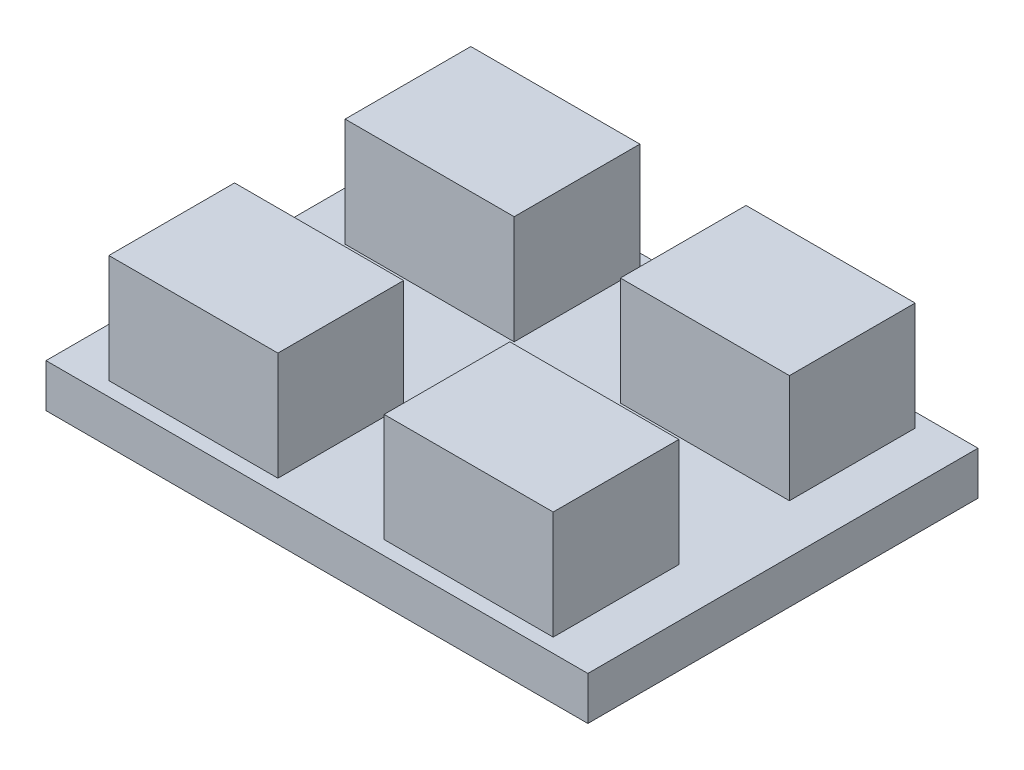
ISO-10303-21;
HEADER;
FILE_DESCRIPTION(('STEP AP214'),'2;1');
FILE_NAME('part.step','',(''),(''),'','','');
FILE_SCHEMA(('AUTOMOTIVE_DESIGN { 1 0 10303 214 1 1 1 1 }'));
ENDSEC;
DATA;
#1=APPLICATION_CONTEXT('core data for automotive mechanical design processes');
#2=APPLICATION_PROTOCOL_DEFINITION('international standard','automotive_design',2000,#1);
#3=PRODUCT_CONTEXT('',#1,'mechanical');
#4=PRODUCT('Part','Part','',(#3));
#5=PRODUCT_RELATED_PRODUCT_CATEGORY('part','',(#4));
#6=PRODUCT_DEFINITION_FORMATION('','',#4);
#7=PRODUCT_DEFINITION_CONTEXT('part definition',#1,'design');
#8=PRODUCT_DEFINITION('design','',#6,#7);
#9=PRODUCT_DEFINITION_SHAPE('','',#8);
#10=(LENGTH_UNIT() NAMED_UNIT(*) SI_UNIT(.MILLI.,.METRE.));
#11=(NAMED_UNIT(*) PLANE_ANGLE_UNIT() SI_UNIT($,.RADIAN.));
#12=(NAMED_UNIT(*) SI_UNIT($,.STERADIAN.) SOLID_ANGLE_UNIT());
#13=UNCERTAINTY_MEASURE_WITH_UNIT(LENGTH_MEASURE(1.E-05),#10,'distance_accuracy_value','');
#14=(GEOMETRIC_REPRESENTATION_CONTEXT(3) GLOBAL_UNCERTAINTY_ASSIGNED_CONTEXT((#13)) GLOBAL_UNIT_ASSIGNED_CONTEXT((#10,
#11,#12)) REPRESENTATION_CONTEXT('',''));
#15=CARTESIAN_POINT('',(0.,0.,0.));
#16=DIRECTION('',(0.,0.,1.));
#17=DIRECTION('',(1.,0.,0.));
#18=AXIS2_PLACEMENT_3D('',#15,#16,#17);
#19=CARTESIAN_POINT('',(0.,2.,0.));
#20=DIRECTION('',(0.,-1.,0.));
#21=DIRECTION('',(0.,0.,-1.));
#22=AXIS2_PLACEMENT_3D('',#19,#20,#21);
#23=PLANE('',#22);
#24=DIRECTION('',(1.,0.,0.));
#25=VECTOR('',#24,1.);
#26=CARTESIAN_POINT('',(2.45,2.,8.35));
#27=LINE('',#26,#25);
#28=CARTESIAN_POINT('',(2.45,2.,8.35));
#29=VERTEX_POINT('',#28);
#30=CARTESIAN_POINT('',(10.25,2.,8.35));
#31=VERTEX_POINT('',#30);
#32=EDGE_CURVE('E191',#29,#31,#27,.T.);
#33=ORIENTED_EDGE('',*,*,#32,.F.);
#34=DIRECTION('',(0.,0.,1.));
#35=VECTOR('',#34,1.);
#36=CARTESIAN_POINT('',(2.45,2.,2.55));
#37=LINE('',#36,#35);
#38=CARTESIAN_POINT('',(2.45,2.,2.55));
#39=VERTEX_POINT('',#38);
#40=EDGE_CURVE('E204',#39,#29,#37,.T.);
#41=ORIENTED_EDGE('',*,*,#40,.F.);
#42=DIRECTION('',(-1.,0.,0.));
#43=VECTOR('',#42,1.);
#44=CARTESIAN_POINT('',(2.45,2.,2.55));
#45=LINE('',#44,#43);
#46=CARTESIAN_POINT('',(10.25,2.,2.55));
#47=VERTEX_POINT('',#46);
#48=EDGE_CURVE('E213',#47,#39,#45,.T.);
#49=ORIENTED_EDGE('',*,*,#48,.F.);
#50=DIRECTION('',(0.,0.,-1.));
#51=VECTOR('',#50,1.);
#52=CARTESIAN_POINT('',(10.25,2.,2.55));
#53=LINE('',#52,#51);
#54=EDGE_CURVE('E194',#31,#47,#53,.T.);
#55=ORIENTED_EDGE('',*,*,#54,.F.);
#56=EDGE_LOOP('',(#33,#41,#49,#55));
#57=FACE_BOUND('',#56,.T.);
#58=DIRECTION('',(0.,0.,-1.));
#59=VECTOR('',#58,1.);
#60=CARTESIAN_POINT('',(-2.45,2.,-8.35));
#61=LINE('',#60,#59);
#62=CARTESIAN_POINT('',(-2.45,2.,-2.55));
#63=VERTEX_POINT('',#62);
#64=CARTESIAN_POINT('',(-2.45,2.,-8.35));
#65=VERTEX_POINT('',#64);
#66=EDGE_CURVE('E262',#63,#65,#61,.T.);
#67=ORIENTED_EDGE('',*,*,#66,.F.);
#68=DIRECTION('',(1.,0.,0.));
#69=VECTOR('',#68,1.);
#70=CARTESIAN_POINT('',(-10.25,2.,-2.55));
#71=LINE('',#70,#69);
#72=CARTESIAN_POINT('',(-10.25,2.,-2.55));
#73=VERTEX_POINT('',#72);
#74=EDGE_CURVE('E267',#73,#63,#71,.T.);
#75=ORIENTED_EDGE('',*,*,#74,.F.);
#76=DIRECTION('',(0.,0.,1.));
#77=VECTOR('',#76,1.);
#78=CARTESIAN_POINT('',(-10.25,2.,-8.35));
#79=LINE('',#78,#77);
#80=CARTESIAN_POINT('',(-10.25,2.,-8.35));
#81=VERTEX_POINT('',#80);
#82=EDGE_CURVE('E279',#81,#73,#79,.T.);
#83=ORIENTED_EDGE('',*,*,#82,.F.);
#84=DIRECTION('',(-1.,0.,0.));
#85=VECTOR('',#84,1.);
#86=CARTESIAN_POINT('',(-10.25,2.,-8.35));
#87=LINE('',#86,#85);
#88=EDGE_CURVE('E276',#65,#81,#87,.T.);
#89=ORIENTED_EDGE('',*,*,#88,.F.);
#90=EDGE_LOOP('',(#67,#75,#83,#89));
#91=FACE_BOUND('',#90,.T.);
#92=DIRECTION('',(0.,0.,-1.));
#93=VECTOR('',#92,1.);
#94=CARTESIAN_POINT('',(12.5,2.,9.));
#95=LINE('',#94,#93);
#96=CARTESIAN_POINT('',(12.5,2.,9.));
#97=VERTEX_POINT('',#96);
#98=CARTESIAN_POINT('',(12.5,2.,-9.));
#99=VERTEX_POINT('',#98);
#100=EDGE_CURVE('E296',#97,#99,#95,.T.);
#101=ORIENTED_EDGE('',*,*,#100,.T.);
#102=DIRECTION('',(-1.,0.,0.));
#103=VECTOR('',#102,1.);
#104=CARTESIAN_POINT('',(-12.5,2.,-9.));
#105=LINE('',#104,#103);
#106=CARTESIAN_POINT('',(-12.5,2.,-9.));
#107=VERTEX_POINT('',#106);
#108=EDGE_CURVE('E299',#99,#107,#105,.T.);
#109=ORIENTED_EDGE('',*,*,#108,.T.);
#110=DIRECTION('',(0.,0.,1.));
#111=VECTOR('',#110,1.);
#112=CARTESIAN_POINT('',(-12.5,2.,9.));
#113=LINE('',#112,#111);
#114=CARTESIAN_POINT('',(-12.5,2.,9.));
#115=VERTEX_POINT('',#114);
#116=EDGE_CURVE('E302',#107,#115,#113,.T.);
#117=ORIENTED_EDGE('',*,*,#116,.T.);
#118=DIRECTION('',(1.,0.,0.));
#119=VECTOR('',#118,1.);
#120=CARTESIAN_POINT('',(-12.5,2.,9.));
#121=LINE('',#120,#119);
#122=EDGE_CURVE('E304',#115,#97,#121,.T.);
#123=ORIENTED_EDGE('',*,*,#122,.T.);
#124=EDGE_LOOP('',(#101,#109,#117,#123));
#125=FACE_BOUND('',#124,.T.);
#126=DIRECTION('',(1.,0.,0.));
#127=VECTOR('',#126,1.);
#128=CARTESIAN_POINT('',(2.45,2.,-2.55));
#129=LINE('',#128,#127);
#130=CARTESIAN_POINT('',(2.45,2.,-2.55));
#131=VERTEX_POINT('',#130);
#132=CARTESIAN_POINT('',(10.25,2.,-2.55));
#133=VERTEX_POINT('',#132);
#134=EDGE_CURVE('E229',#131,#133,#129,.T.);
#135=ORIENTED_EDGE('',*,*,#134,.F.);
#136=DIRECTION('',(0.,0.,1.));
#137=VECTOR('',#136,1.);
#138=CARTESIAN_POINT('',(2.45,2.,-8.35));
#139=LINE('',#138,#137);
#140=CARTESIAN_POINT('',(2.45,2.,-8.35));
#141=VERTEX_POINT('',#140);
#142=EDGE_CURVE('E234',#141,#131,#139,.T.);
#143=ORIENTED_EDGE('',*,*,#142,.F.);
#144=DIRECTION('',(-1.,0.,0.));
#145=VECTOR('',#144,1.);
#146=CARTESIAN_POINT('',(2.45,2.,-8.35));
#147=LINE('',#146,#145);
#148=CARTESIAN_POINT('',(10.25,2.,-8.35));
#149=VERTEX_POINT('',#148);
#150=EDGE_CURVE('E246',#149,#141,#147,.T.);
#151=ORIENTED_EDGE('',*,*,#150,.F.);
#152=DIRECTION('',(0.,0.,-1.));
#153=VECTOR('',#152,1.);
#154=CARTESIAN_POINT('',(10.25,2.,-8.35));
#155=LINE('',#154,#153);
#156=EDGE_CURVE('E243',#133,#149,#155,.T.);
#157=ORIENTED_EDGE('',*,*,#156,.F.);
#158=EDGE_LOOP('',(#135,#143,#151,#157));
#159=FACE_BOUND('',#158,.T.);
#160=DIRECTION('',(1.,0.,0.));
#161=VECTOR('',#160,1.);
#162=CARTESIAN_POINT('',(-10.25,2.,8.35));
#163=LINE('',#162,#161);
#164=CARTESIAN_POINT('',(-10.25,2.,8.35));
#165=VERTEX_POINT('',#164);
#166=CARTESIAN_POINT('',(-2.45,2.,8.35));
#167=VERTEX_POINT('',#166);
#168=EDGE_CURVE('E190',#165,#167,#163,.T.);
#169=ORIENTED_EDGE('',*,*,#168,.F.);
#170=DIRECTION('',(0.,0.,1.));
#171=VECTOR('',#170,1.);
#172=CARTESIAN_POINT('',(-10.25,2.,2.55));
#173=LINE('',#172,#171);
#174=CARTESIAN_POINT('',(-10.25,2.,2.55));
#175=VERTEX_POINT('',#174);
#176=EDGE_CURVE('E187',#175,#165,#173,.T.);
#177=ORIENTED_EDGE('',*,*,#176,.F.);
#178=DIRECTION('',(-1.,0.,0.));
#179=VECTOR('',#178,1.);
#180=CARTESIAN_POINT('',(-10.25,2.,2.55));
#181=LINE('',#180,#179);
#182=CARTESIAN_POINT('',(-2.45,2.,2.55));
#183=VERTEX_POINT('',#182);
#184=EDGE_CURVE('E53',#183,#175,#181,.T.);
#185=ORIENTED_EDGE('',*,*,#184,.F.);
#186=DIRECTION('',(0.,0.,-1.));
#187=VECTOR('',#186,1.);
#188=CARTESIAN_POINT('',(-2.45,2.,2.55));
#189=LINE('',#188,#187);
#190=EDGE_CURVE('E48',#167,#183,#189,.T.);
#191=ORIENTED_EDGE('',*,*,#190,.F.);
#192=EDGE_LOOP('',(#169,#177,#185,#191));
#193=FACE_BOUND('',#192,.T.);
#194=ADVANCED_FACE('F33',(#57,#91,#125,#159,#193),#23,.F.);
#195=CARTESIAN_POINT('',(12.5,2.,9.));
#196=DIRECTION('',(-1.,0.,0.));
#197=DIRECTION('',(0.,0.,1.));
#198=AXIS2_PLACEMENT_3D('',#195,#196,#197);
#199=PLANE('',#198);
#200=DIRECTION('',(0.,0.,-1.));
#201=VECTOR('',#200,1.);
#202=CARTESIAN_POINT('',(12.5,0.,9.));
#203=LINE('',#202,#201);
#204=CARTESIAN_POINT('',(12.5,0.,9.));
#205=VERTEX_POINT('',#204);
#206=CARTESIAN_POINT('',(12.5,0.,-9.));
#207=VERTEX_POINT('',#206);
#208=EDGE_CURVE('E295',#205,#207,#203,.T.);
#209=ORIENTED_EDGE('',*,*,#208,.T.);
#210=DIRECTION('',(0.,-1.,0.));
#211=VECTOR('',#210,1.);
#212=CARTESIAN_POINT('',(12.5,2.,-9.));
#213=LINE('',#212,#211);
#214=EDGE_CURVE('E11',#99,#207,#213,.T.);
#215=ORIENTED_EDGE('',*,*,#214,.F.);
#216=ORIENTED_EDGE('',*,*,#100,.F.);
#217=DIRECTION('',(0.,-1.,0.));
#218=VECTOR('',#217,1.);
#219=CARTESIAN_POINT('',(12.5,2.,9.));
#220=LINE('',#219,#218);
#221=EDGE_CURVE('E306',#97,#205,#220,.T.);
#222=ORIENTED_EDGE('',*,*,#221,.T.);
#223=EDGE_LOOP('',(#209,#215,#216,#222));
#224=FACE_BOUND('',#223,.T.);
#225=ADVANCED_FACE('F35',(#224),#199,.F.);
#226=CARTESIAN_POINT('',(-12.5,2.,-9.));
#227=DIRECTION('',(0.,0.,1.));
#228=DIRECTION('',(1.,0.,0.));
#229=AXIS2_PLACEMENT_3D('',#226,#227,#228);
#230=PLANE('',#229);
#231=DIRECTION('',(-1.,0.,0.));
#232=VECTOR('',#231,1.);
#233=CARTESIAN_POINT('',(-12.5,0.,-9.));
#234=LINE('',#233,#232);
#235=CARTESIAN_POINT('',(-12.5,0.,-9.));
#236=VERTEX_POINT('',#235);
#237=EDGE_CURVE('E309',#207,#236,#234,.T.);
#238=ORIENTED_EDGE('',*,*,#237,.T.);
#239=DIRECTION('',(0.,-1.,0.));
#240=VECTOR('',#239,1.);
#241=CARTESIAN_POINT('',(-12.5,2.,-9.));
#242=LINE('',#241,#240);
#243=EDGE_CURVE('E41',#107,#236,#242,.T.);
#244=ORIENTED_EDGE('',*,*,#243,.F.);
#245=ORIENTED_EDGE('',*,*,#108,.F.);
#246=ORIENTED_EDGE('',*,*,#214,.T.);
#247=EDGE_LOOP('',(#238,#244,#245,#246));
#248=FACE_BOUND('',#247,.T.);
#249=ADVANCED_FACE('F339',(#248),#230,.F.);
#250=CARTESIAN_POINT('',(-12.5,2.,9.));
#251=DIRECTION('',(1.,0.,0.));
#252=DIRECTION('',(0.,0.,-1.));
#253=AXIS2_PLACEMENT_3D('',#250,#251,#252);
#254=PLANE('',#253);
#255=DIRECTION('',(0.,0.,1.));
#256=VECTOR('',#255,1.);
#257=CARTESIAN_POINT('',(-12.5,0.,9.));
#258=LINE('',#257,#256);
#259=CARTESIAN_POINT('',(-12.5,0.,9.));
#260=VERTEX_POINT('',#259);
#261=EDGE_CURVE('E311',#236,#260,#258,.T.);
#262=ORIENTED_EDGE('',*,*,#261,.T.);
#263=DIRECTION('',(0.,-1.,0.));
#264=VECTOR('',#263,1.);
#265=CARTESIAN_POINT('',(-12.5,2.,9.));
#266=LINE('',#265,#264);
#267=EDGE_CURVE('E316',#115,#260,#266,.T.);
#268=ORIENTED_EDGE('',*,*,#267,.F.);
#269=ORIENTED_EDGE('',*,*,#116,.F.);
#270=ORIENTED_EDGE('',*,*,#243,.T.);
#271=EDGE_LOOP('',(#262,#268,#269,#270));
#272=FACE_BOUND('',#271,.T.);
#273=ADVANCED_FACE('F323',(#272),#254,.F.);
#274=CARTESIAN_POINT('',(-12.5,2.,9.));
#275=DIRECTION('',(0.,0.,-1.));
#276=DIRECTION('',(-1.,0.,0.));
#277=AXIS2_PLACEMENT_3D('',#274,#275,#276);
#278=PLANE('',#277);
#279=DIRECTION('',(1.,0.,0.));
#280=VECTOR('',#279,1.);
#281=CARTESIAN_POINT('',(-12.5,0.,9.));
#282=LINE('',#281,#280);
#283=EDGE_CURVE('E300',#260,#205,#282,.T.);
#284=ORIENTED_EDGE('',*,*,#283,.T.);
#285=ORIENTED_EDGE('',*,*,#221,.F.);
#286=ORIENTED_EDGE('',*,*,#122,.F.);
#287=ORIENTED_EDGE('',*,*,#267,.T.);
#288=EDGE_LOOP('',(#284,#285,#286,#287));
#289=FACE_BOUND('',#288,.T.);
#290=ADVANCED_FACE('F332',(#289),#278,.F.);
#291=CARTESIAN_POINT('',(0.,0.,0.));
#292=DIRECTION('',(0.,-1.,0.));
#293=DIRECTION('',(0.,0.,-1.));
#294=AXIS2_PLACEMENT_3D('',#291,#292,#293);
#295=PLANE('',#294);
#296=ORIENTED_EDGE('',*,*,#208,.F.);
#297=ORIENTED_EDGE('',*,*,#283,.F.);
#298=ORIENTED_EDGE('',*,*,#261,.F.);
#299=ORIENTED_EDGE('',*,*,#237,.F.);
#300=EDGE_LOOP('',(#296,#297,#298,#299));
#301=FACE_BOUND('',#300,.T.);
#302=ADVANCED_FACE('F329',(#301),#295,.T.);
#303=CARTESIAN_POINT('',(-2.45,7.,-8.35));
#304=DIRECTION('',(-1.,0.,0.));
#305=DIRECTION('',(0.,0.,1.));
#306=AXIS2_PLACEMENT_3D('',#303,#304,#305);
#307=PLANE('',#306);
#308=ORIENTED_EDGE('',*,*,#66,.T.);
#309=DIRECTION('',(0.,-1.,0.));
#310=VECTOR('',#309,1.);
#311=CARTESIAN_POINT('',(-2.45,7.,-8.35));
#312=LINE('',#311,#310);
#313=CARTESIAN_POINT('',(-2.45,7.,-8.35));
#314=VERTEX_POINT('',#313);
#315=EDGE_CURVE('E292',#314,#65,#312,.T.);
#316=ORIENTED_EDGE('',*,*,#315,.F.);
#317=DIRECTION('',(0.,0.,-1.));
#318=VECTOR('',#317,1.);
#319=CARTESIAN_POINT('',(-2.45,7.,-8.35));
#320=LINE('',#319,#318);
#321=CARTESIAN_POINT('',(-2.45,7.,-2.55));
#322=VERTEX_POINT('',#321);
#323=EDGE_CURVE('E263',#322,#314,#320,.T.);
#324=ORIENTED_EDGE('',*,*,#323,.F.);
#325=DIRECTION('',(0.,-1.,0.));
#326=VECTOR('',#325,1.);
#327=CARTESIAN_POINT('',(-2.45,7.,-2.55));
#328=LINE('',#327,#326);
#329=EDGE_CURVE('E273',#322,#63,#328,.T.);
#330=ORIENTED_EDGE('',*,*,#329,.T.);
#331=EDGE_LOOP('',(#308,#316,#324,#330));
#332=FACE_BOUND('',#331,.T.);
#333=ADVANCED_FACE('F354',(#332),#307,.F.);
#334=CARTESIAN_POINT('',(-10.25,7.,-8.35));
#335=DIRECTION('',(0.,0.,1.));
#336=DIRECTION('',(1.,0.,0.));
#337=AXIS2_PLACEMENT_3D('',#334,#335,#336);
#338=PLANE('',#337);
#339=ORIENTED_EDGE('',*,*,#88,.T.);
#340=DIRECTION('',(0.,-1.,0.));
#341=VECTOR('',#340,1.);
#342=CARTESIAN_POINT('',(-10.25,7.,-8.35));
#343=LINE('',#342,#341);
#344=CARTESIAN_POINT('',(-10.25,7.,-8.35));
#345=VERTEX_POINT('',#344);
#346=EDGE_CURVE('E289',#345,#81,#343,.T.);
#347=ORIENTED_EDGE('',*,*,#346,.F.);
#348=DIRECTION('',(-1.,0.,0.));
#349=VECTOR('',#348,1.);
#350=CARTESIAN_POINT('',(-10.25,7.,-8.35));
#351=LINE('',#350,#349);
#352=EDGE_CURVE('E266',#314,#345,#351,.T.);
#353=ORIENTED_EDGE('',*,*,#352,.F.);
#354=ORIENTED_EDGE('',*,*,#315,.T.);
#355=EDGE_LOOP('',(#339,#347,#353,#354));
#356=FACE_BOUND('',#355,.T.);
#357=ADVANCED_FACE('F373',(#356),#338,.F.);
#358=CARTESIAN_POINT('',(-10.25,7.,-8.35));
#359=DIRECTION('',(1.,0.,0.));
#360=DIRECTION('',(0.,0.,-1.));
#361=AXIS2_PLACEMENT_3D('',#358,#359,#360);
#362=PLANE('',#361);
#363=ORIENTED_EDGE('',*,*,#82,.T.);
#364=DIRECTION('',(0.,-1.,0.));
#365=VECTOR('',#364,1.);
#366=CARTESIAN_POINT('',(-10.25,7.,-2.55));
#367=LINE('',#366,#365);
#368=CARTESIAN_POINT('',(-10.25,7.,-2.55));
#369=VERTEX_POINT('',#368);
#370=EDGE_CURVE('E286',#369,#73,#367,.T.);
#371=ORIENTED_EDGE('',*,*,#370,.F.);
#372=DIRECTION('',(0.,0.,1.));
#373=VECTOR('',#372,1.);
#374=CARTESIAN_POINT('',(-10.25,7.,-8.35));
#375=LINE('',#374,#373);
#376=EDGE_CURVE('E269',#345,#369,#375,.T.);
#377=ORIENTED_EDGE('',*,*,#376,.F.);
#378=ORIENTED_EDGE('',*,*,#346,.T.);
#379=EDGE_LOOP('',(#363,#371,#377,#378));
#380=FACE_BOUND('',#379,.T.);
#381=ADVANCED_FACE('F380',(#380),#362,.F.);
#382=CARTESIAN_POINT('',(-10.25,7.,-2.55));
#383=DIRECTION('',(0.,0.,-1.));
#384=DIRECTION('',(-1.,0.,0.));
#385=AXIS2_PLACEMENT_3D('',#382,#383,#384);
#386=PLANE('',#385);
#387=ORIENTED_EDGE('',*,*,#74,.T.);
#388=ORIENTED_EDGE('',*,*,#329,.F.);
#389=DIRECTION('',(1.,0.,0.));
#390=VECTOR('',#389,1.);
#391=CARTESIAN_POINT('',(-10.25,7.,-2.55));
#392=LINE('',#391,#390);
#393=EDGE_CURVE('E271',#369,#322,#392,.T.);
#394=ORIENTED_EDGE('',*,*,#393,.F.);
#395=ORIENTED_EDGE('',*,*,#370,.T.);
#396=EDGE_LOOP('',(#387,#388,#394,#395));
#397=FACE_BOUND('',#396,.T.);
#398=ADVANCED_FACE('F387',(#397),#386,.F.);
#399=CARTESIAN_POINT('',(0.,7.,0.));
#400=DIRECTION('',(0.,1.,0.));
#401=DIRECTION('',(0.,0.,1.));
#402=AXIS2_PLACEMENT_3D('',#399,#400,#401);
#403=PLANE('',#402);
#404=ORIENTED_EDGE('',*,*,#323,.T.);
#405=ORIENTED_EDGE('',*,*,#352,.T.);
#406=ORIENTED_EDGE('',*,*,#376,.T.);
#407=ORIENTED_EDGE('',*,*,#393,.T.);
#408=EDGE_LOOP('',(#404,#405,#406,#407));
#409=FACE_BOUND('',#408,.T.);
#410=ADVANCED_FACE('F395',(#409),#403,.T.);
#411=CARTESIAN_POINT('',(2.45,7.,-2.55));
#412=DIRECTION('',(0.,0.,-1.));
#413=DIRECTION('',(-1.,0.,0.));
#414=AXIS2_PLACEMENT_3D('',#411,#412,#413);
#415=PLANE('',#414);
#416=ORIENTED_EDGE('',*,*,#134,.T.);
#417=DIRECTION('',(0.,-1.,0.));
#418=VECTOR('',#417,1.);
#419=CARTESIAN_POINT('',(10.25,7.,-2.55));
#420=LINE('',#419,#418);
#421=CARTESIAN_POINT('',(10.25,7.,-2.55));
#422=VERTEX_POINT('',#421);
#423=EDGE_CURVE('E259',#422,#133,#420,.T.);
#424=ORIENTED_EDGE('',*,*,#423,.F.);
#425=DIRECTION('',(1.,0.,0.));
#426=VECTOR('',#425,1.);
#427=CARTESIAN_POINT('',(2.45,7.,-2.55));
#428=LINE('',#427,#426);
#429=CARTESIAN_POINT('',(2.45,7.,-2.55));
#430=VERTEX_POINT('',#429);
#431=EDGE_CURVE('E230',#430,#422,#428,.T.);
#432=ORIENTED_EDGE('',*,*,#431,.F.);
#433=DIRECTION('',(0.,-1.,0.));
#434=VECTOR('',#433,1.);
#435=CARTESIAN_POINT('',(2.45,7.,-2.55));
#436=LINE('',#435,#434);
#437=EDGE_CURVE('E240',#430,#131,#436,.T.);
#438=ORIENTED_EDGE('',*,*,#437,.T.);
#439=EDGE_LOOP('',(#416,#424,#432,#438));
#440=FACE_BOUND('',#439,.T.);
#441=ADVANCED_FACE('F403',(#440),#415,.F.);
#442=CARTESIAN_POINT('',(10.25,7.,-8.35));
#443=DIRECTION('',(-1.,0.,0.));
#444=DIRECTION('',(0.,0.,1.));
#445=AXIS2_PLACEMENT_3D('',#442,#443,#444);
#446=PLANE('',#445);
#447=ORIENTED_EDGE('',*,*,#156,.T.);
#448=DIRECTION('',(0.,-1.,0.));
#449=VECTOR('',#448,1.);
#450=CARTESIAN_POINT('',(10.25,7.,-8.35));
#451=LINE('',#450,#449);
#452=CARTESIAN_POINT('',(10.25,7.,-8.35));
#453=VERTEX_POINT('',#452);
#454=EDGE_CURVE('E256',#453,#149,#451,.T.);
#455=ORIENTED_EDGE('',*,*,#454,.F.);
#456=DIRECTION('',(0.,0.,-1.));
#457=VECTOR('',#456,1.);
#458=CARTESIAN_POINT('',(10.25,7.,-8.35));
#459=LINE('',#458,#457);
#460=EDGE_CURVE('E233',#422,#453,#459,.T.);
#461=ORIENTED_EDGE('',*,*,#460,.F.);
#462=ORIENTED_EDGE('',*,*,#423,.T.);
#463=EDGE_LOOP('',(#447,#455,#461,#462));
#464=FACE_BOUND('',#463,.T.);
#465=ADVANCED_FACE('F411',(#464),#446,.F.);
#466=CARTESIAN_POINT('',(2.45,7.,-8.35));
#467=DIRECTION('',(0.,0.,1.));
#468=DIRECTION('',(1.,0.,0.));
#469=AXIS2_PLACEMENT_3D('',#466,#467,#468);
#470=PLANE('',#469);
#471=ORIENTED_EDGE('',*,*,#150,.T.);
#472=DIRECTION('',(0.,-1.,0.));
#473=VECTOR('',#472,1.);
#474=CARTESIAN_POINT('',(2.45,7.,-8.35));
#475=LINE('',#474,#473);
#476=CARTESIAN_POINT('',(2.45,7.,-8.35));
#477=VERTEX_POINT('',#476);
#478=EDGE_CURVE('E253',#477,#141,#475,.T.);
#479=ORIENTED_EDGE('',*,*,#478,.F.);
#480=DIRECTION('',(-1.,0.,0.));
#481=VECTOR('',#480,1.);
#482=CARTESIAN_POINT('',(2.45,7.,-8.35));
#483=LINE('',#482,#481);
#484=EDGE_CURVE('E236',#453,#477,#483,.T.);
#485=ORIENTED_EDGE('',*,*,#484,.F.);
#486=ORIENTED_EDGE('',*,*,#454,.T.);
#487=EDGE_LOOP('',(#471,#479,#485,#486));
#488=FACE_BOUND('',#487,.T.);
#489=ADVANCED_FACE('F419',(#488),#470,.F.);
#490=CARTESIAN_POINT('',(2.45,7.,-8.35));
#491=DIRECTION('',(1.,0.,0.));
#492=DIRECTION('',(0.,0.,-1.));
#493=AXIS2_PLACEMENT_3D('',#490,#491,#492);
#494=PLANE('',#493);
#495=ORIENTED_EDGE('',*,*,#142,.T.);
#496=ORIENTED_EDGE('',*,*,#437,.F.);
#497=DIRECTION('',(0.,0.,1.));
#498=VECTOR('',#497,1.);
#499=CARTESIAN_POINT('',(2.45,7.,-8.35));
#500=LINE('',#499,#498);
#501=EDGE_CURVE('E238',#477,#430,#500,.T.);
#502=ORIENTED_EDGE('',*,*,#501,.F.);
#503=ORIENTED_EDGE('',*,*,#478,.T.);
#504=EDGE_LOOP('',(#495,#496,#502,#503));
#505=FACE_BOUND('',#504,.T.);
#506=ADVANCED_FACE('F427',(#505),#494,.F.);
#507=CARTESIAN_POINT('',(0.,7.,0.));
#508=DIRECTION('',(0.,-1.,0.));
#509=DIRECTION('',(0.,0.,-1.));
#510=AXIS2_PLACEMENT_3D('',#507,#508,#509);
#511=PLANE('',#510);
#512=ORIENTED_EDGE('',*,*,#431,.T.);
#513=ORIENTED_EDGE('',*,*,#460,.T.);
#514=ORIENTED_EDGE('',*,*,#484,.T.);
#515=ORIENTED_EDGE('',*,*,#501,.T.);
#516=EDGE_LOOP('',(#512,#513,#514,#515));
#517=FACE_BOUND('',#516,.T.);
#518=ADVANCED_FACE('F435',(#517),#511,.F.);
#519=CARTESIAN_POINT('',(2.45,7.,8.35));
#520=DIRECTION('',(0.,0.,-1.));
#521=DIRECTION('',(-1.,0.,0.));
#522=AXIS2_PLACEMENT_3D('',#519,#520,#521);
#523=PLANE('',#522);
#524=ORIENTED_EDGE('',*,*,#32,.T.);
#525=DIRECTION('',(0.,-1.,0.));
#526=VECTOR('',#525,1.);
#527=CARTESIAN_POINT('',(10.25,7.,8.35));
#528=LINE('',#527,#526);
#529=CARTESIAN_POINT('',(10.25,7.,8.35));
#530=VERTEX_POINT('',#529);
#531=EDGE_CURVE('E226',#530,#31,#528,.T.);
#532=ORIENTED_EDGE('',*,*,#531,.F.);
#533=DIRECTION('',(1.,0.,0.));
#534=VECTOR('',#533,1.);
#535=CARTESIAN_POINT('',(2.45,7.,8.35));
#536=LINE('',#535,#534);
#537=CARTESIAN_POINT('',(2.45,7.,8.35));
#538=VERTEX_POINT('',#537);
#539=EDGE_CURVE('E200',#538,#530,#536,.T.);
#540=ORIENTED_EDGE('',*,*,#539,.F.);
#541=DIRECTION('',(0.,-1.,0.));
#542=VECTOR('',#541,1.);
#543=CARTESIAN_POINT('',(2.45,7.,8.35));
#544=LINE('',#543,#542);
#545=EDGE_CURVE('E209',#538,#29,#544,.T.);
#546=ORIENTED_EDGE('',*,*,#545,.T.);
#547=EDGE_LOOP('',(#524,#532,#540,#546));
#548=FACE_BOUND('',#547,.T.);
#549=ADVANCED_FACE('F443',(#548),#523,.F.);
#550=CARTESIAN_POINT('',(10.25,7.,2.55));
#551=DIRECTION('',(-1.,0.,0.));
#552=DIRECTION('',(0.,0.,1.));
#553=AXIS2_PLACEMENT_3D('',#550,#551,#552);
#554=PLANE('',#553);
#555=ORIENTED_EDGE('',*,*,#54,.T.);
#556=DIRECTION('',(0.,-1.,0.));
#557=VECTOR('',#556,1.);
#558=CARTESIAN_POINT('',(10.25,7.,2.55));
#559=LINE('',#558,#557);
#560=CARTESIAN_POINT('',(10.25,7.,2.55));
#561=VERTEX_POINT('',#560);
#562=EDGE_CURVE('E223',#561,#47,#559,.T.);
#563=ORIENTED_EDGE('',*,*,#562,.F.);
#564=DIRECTION('',(0.,0.,-1.));
#565=VECTOR('',#564,1.);
#566=CARTESIAN_POINT('',(10.25,7.,2.55));
#567=LINE('',#566,#565);
#568=EDGE_CURVE('E203',#530,#561,#567,.T.);
#569=ORIENTED_EDGE('',*,*,#568,.F.);
#570=ORIENTED_EDGE('',*,*,#531,.T.);
#571=EDGE_LOOP('',(#555,#563,#569,#570));
#572=FACE_BOUND('',#571,.T.);
#573=ADVANCED_FACE('F451',(#572),#554,.F.);
#574=CARTESIAN_POINT('',(2.45,7.,2.55));
#575=DIRECTION('',(0.,0.,1.));
#576=DIRECTION('',(1.,0.,0.));
#577=AXIS2_PLACEMENT_3D('',#574,#575,#576);
#578=PLANE('',#577);
#579=ORIENTED_EDGE('',*,*,#48,.T.);
#580=DIRECTION('',(0.,-1.,0.));
#581=VECTOR('',#580,1.);
#582=CARTESIAN_POINT('',(2.45,7.,2.55));
#583=LINE('',#582,#581);
#584=CARTESIAN_POINT('',(2.45,7.,2.55));
#585=VERTEX_POINT('',#584);
#586=EDGE_CURVE('E220',#585,#39,#583,.T.);
#587=ORIENTED_EDGE('',*,*,#586,.F.);
#588=DIRECTION('',(-1.,0.,0.));
#589=VECTOR('',#588,1.);
#590=CARTESIAN_POINT('',(2.45,7.,2.55));
#591=LINE('',#590,#589);
#592=EDGE_CURVE('E206',#561,#585,#591,.T.);
#593=ORIENTED_EDGE('',*,*,#592,.F.);
#594=ORIENTED_EDGE('',*,*,#562,.T.);
#595=EDGE_LOOP('',(#579,#587,#593,#594));
#596=FACE_BOUND('',#595,.T.);
#597=ADVANCED_FACE('F459',(#596),#578,.F.);
#598=CARTESIAN_POINT('',(2.45,7.,2.55));
#599=DIRECTION('',(1.,0.,0.));
#600=DIRECTION('',(0.,0.,-1.));
#601=AXIS2_PLACEMENT_3D('',#598,#599,#600);
#602=PLANE('',#601);
#603=ORIENTED_EDGE('',*,*,#40,.T.);
#604=ORIENTED_EDGE('',*,*,#545,.F.);
#605=DIRECTION('',(0.,0.,1.));
#606=VECTOR('',#605,1.);
#607=CARTESIAN_POINT('',(2.45,7.,2.55));
#608=LINE('',#607,#606);
#609=EDGE_CURVE('E208',#585,#538,#608,.T.);
#610=ORIENTED_EDGE('',*,*,#609,.F.);
#611=ORIENTED_EDGE('',*,*,#586,.T.);
#612=EDGE_LOOP('',(#603,#604,#610,#611));
#613=FACE_BOUND('',#612,.T.);
#614=ADVANCED_FACE('F467',(#613),#602,.F.);
#615=CARTESIAN_POINT('',(0.,7.,0.));
#616=DIRECTION('',(0.,-1.,0.));
#617=DIRECTION('',(0.,0.,-1.));
#618=AXIS2_PLACEMENT_3D('',#615,#616,#617);
#619=PLANE('',#618);
#620=ORIENTED_EDGE('',*,*,#539,.T.);
#621=ORIENTED_EDGE('',*,*,#568,.T.);
#622=ORIENTED_EDGE('',*,*,#592,.T.);
#623=ORIENTED_EDGE('',*,*,#609,.T.);
#624=EDGE_LOOP('',(#620,#621,#622,#623));
#625=FACE_BOUND('',#624,.T.);
#626=ADVANCED_FACE('F475',(#625),#619,.F.);
#627=CARTESIAN_POINT('',(-10.25,7.,8.35));
#628=DIRECTION('',(0.,0.,-1.));
#629=DIRECTION('',(-1.,0.,0.));
#630=AXIS2_PLACEMENT_3D('',#627,#628,#629);
#631=PLANE('',#630);
#632=ORIENTED_EDGE('',*,*,#168,.T.);
#633=DIRECTION('',(0.,-1.,0.));
#634=VECTOR('',#633,1.);
#635=CARTESIAN_POINT('',(-2.45,7.,8.35));
#636=LINE('',#635,#634);
#637=CARTESIAN_POINT('',(-2.45,7.,8.35));
#638=VERTEX_POINT('',#637);
#639=EDGE_CURVE('E171',#638,#167,#636,.T.);
#640=ORIENTED_EDGE('',*,*,#639,.F.);
#641=DIRECTION('',(1.,0.,0.));
#642=VECTOR('',#641,1.);
#643=CARTESIAN_POINT('',(-10.25,7.,8.35));
#644=LINE('',#643,#642);
#645=CARTESIAN_POINT('',(-10.25,7.,8.35));
#646=VERTEX_POINT('',#645);
#647=EDGE_CURVE('E178',#646,#638,#644,.T.);
#648=ORIENTED_EDGE('',*,*,#647,.F.);
#649=DIRECTION('',(0.,-1.,0.));
#650=VECTOR('',#649,1.);
#651=CARTESIAN_POINT('',(-10.25,7.,8.35));
#652=LINE('',#651,#650);
#653=EDGE_CURVE('E584',#646,#165,#652,.T.);
#654=ORIENTED_EDGE('',*,*,#653,.T.);
#655=EDGE_LOOP('',(#632,#640,#648,#654));
#656=FACE_BOUND('',#655,.T.);
#657=ADVANCED_FACE('F189',(#656),#631,.F.);
#658=CARTESIAN_POINT('',(-2.45,7.,2.55));
#659=DIRECTION('',(-1.,0.,0.));
#660=DIRECTION('',(0.,0.,1.));
#661=AXIS2_PLACEMENT_3D('',#658,#659,#660);
#662=PLANE('',#661);
#663=ORIENTED_EDGE('',*,*,#190,.T.);
#664=DIRECTION('',(0.,-1.,0.));
#665=VECTOR('',#664,1.);
#666=CARTESIAN_POINT('',(-2.45,7.,2.55));
#667=LINE('',#666,#665);
#668=CARTESIAN_POINT('',(-2.45,7.,2.55));
#669=VERTEX_POINT('',#668);
#670=EDGE_CURVE('E174',#669,#183,#667,.T.);
#671=ORIENTED_EDGE('',*,*,#670,.F.);
#672=DIRECTION('',(0.,0.,-1.));
#673=VECTOR('',#672,1.);
#674=CARTESIAN_POINT('',(-2.45,7.,2.55));
#675=LINE('',#674,#673);
#676=EDGE_CURVE('E167',#638,#669,#675,.T.);
#677=ORIENTED_EDGE('',*,*,#676,.F.);
#678=ORIENTED_EDGE('',*,*,#639,.T.);
#679=EDGE_LOOP('',(#663,#671,#677,#678));
#680=FACE_BOUND('',#679,.T.);
#681=ADVANCED_FACE('F169',(#680),#662,.F.);
#682=CARTESIAN_POINT('',(-10.25,7.,2.55));
#683=DIRECTION('',(0.,0.,1.));
#684=DIRECTION('',(1.,0.,0.));
#685=AXIS2_PLACEMENT_3D('',#682,#683,#684);
#686=PLANE('',#685);
#687=ORIENTED_EDGE('',*,*,#184,.T.);
#688=DIRECTION('',(0.,-1.,0.));
#689=VECTOR('',#688,1.);
#690=CARTESIAN_POINT('',(-10.25,7.,2.55));
#691=LINE('',#690,#689);
#692=CARTESIAN_POINT('',(-10.25,7.,2.55));
#693=VERTEX_POINT('',#692);
#694=EDGE_CURVE('E196',#693,#175,#691,.T.);
#695=ORIENTED_EDGE('',*,*,#694,.F.);
#696=DIRECTION('',(-1.,0.,0.));
#697=VECTOR('',#696,1.);
#698=CARTESIAN_POINT('',(-10.25,7.,2.55));
#699=LINE('',#698,#697);
#700=EDGE_CURVE('E177',#669,#693,#699,.T.);
#701=ORIENTED_EDGE('',*,*,#700,.F.);
#702=ORIENTED_EDGE('',*,*,#670,.T.);
#703=EDGE_LOOP('',(#687,#695,#701,#702));
#704=FACE_BOUND('',#703,.T.);
#705=ADVANCED_FACE('F496',(#704),#686,.F.);
#706=CARTESIAN_POINT('',(-10.25,7.,2.55));
#707=DIRECTION('',(1.,0.,0.));
#708=DIRECTION('',(0.,0.,-1.));
#709=AXIS2_PLACEMENT_3D('',#706,#707,#708);
#710=PLANE('',#709);
#711=ORIENTED_EDGE('',*,*,#176,.T.);
#712=ORIENTED_EDGE('',*,*,#653,.F.);
#713=DIRECTION('',(0.,0.,1.));
#714=VECTOR('',#713,1.);
#715=CARTESIAN_POINT('',(-10.25,7.,2.55));
#716=LINE('',#715,#714);
#717=EDGE_CURVE('E183',#693,#646,#716,.T.);
#718=ORIENTED_EDGE('',*,*,#717,.F.);
#719=ORIENTED_EDGE('',*,*,#694,.T.);
#720=EDGE_LOOP('',(#711,#712,#718,#719));
#721=FACE_BOUND('',#720,.T.);
#722=ADVANCED_FACE('F503',(#721),#710,.F.);
#723=CARTESIAN_POINT('',(0.,7.,0.));
#724=DIRECTION('',(0.,-1.,0.));
#725=DIRECTION('',(0.,0.,-1.));
#726=AXIS2_PLACEMENT_3D('',#723,#724,#725);
#727=PLANE('',#726);
#728=ORIENTED_EDGE('',*,*,#647,.T.);
#729=ORIENTED_EDGE('',*,*,#676,.T.);
#730=ORIENTED_EDGE('',*,*,#700,.T.);
#731=ORIENTED_EDGE('',*,*,#717,.T.);
#732=EDGE_LOOP('',(#728,#729,#730,#731));
#733=FACE_BOUND('',#732,.T.);
#734=ADVANCED_FACE('F181',(#733),#727,.F.);
#735=CLOSED_SHELL('',(#194,#225,#249,#273,#290,#302,#333,#357,#381,#398,#410,#441,#465,#489,
#506,#518,#549,#573,#597,#614,#626,#657,#681,#705,#722,#734));
#736=MANIFOLD_SOLID_BREP('B2',#735);
#737=ADVANCED_BREP_SHAPE_REPRESENTATION('',(#18,#736),#14);
#738=SHAPE_DEFINITION_REPRESENTATION(#9,#737);
ENDSEC;
END-ISO-10303-21;
